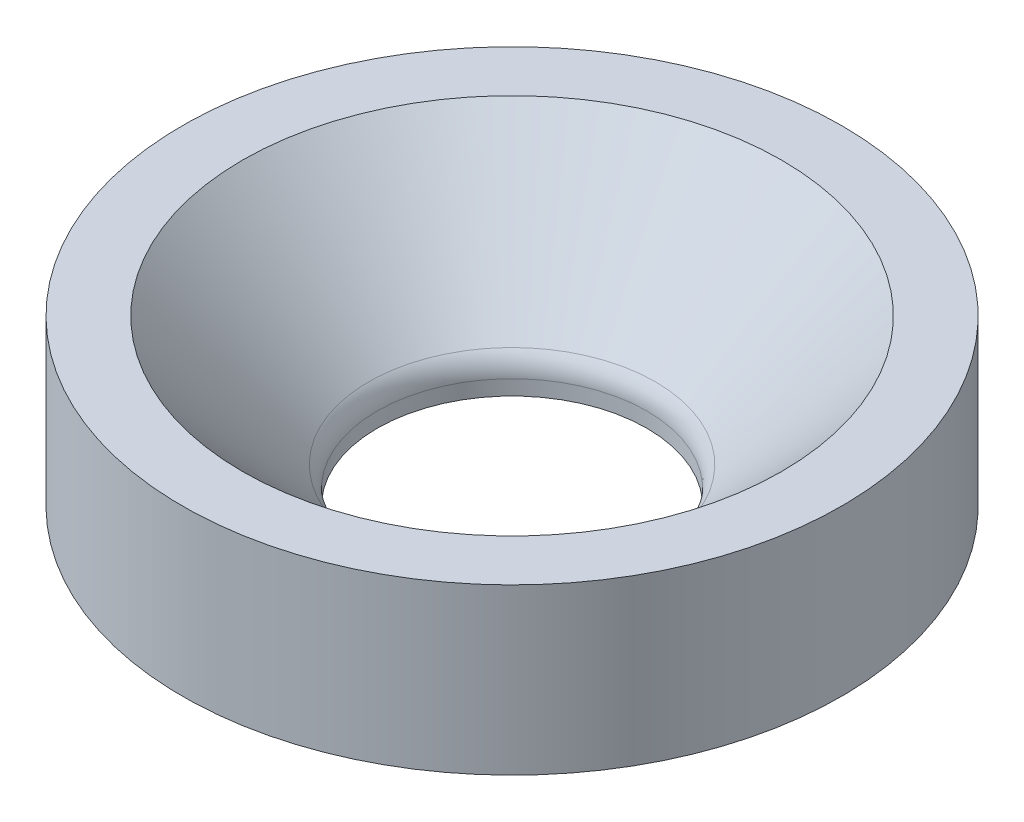
ISO-10303-21;
HEADER;
FILE_DESCRIPTION(('STEP AP214'),'2;1');
FILE_NAME('part.step','',(''),(''),'','','');
FILE_SCHEMA(('AUTOMOTIVE_DESIGN { 1 0 10303 214 1 1 1 1 }'));
ENDSEC;
DATA;
#1=APPLICATION_CONTEXT('core data for automotive mechanical design processes');
#2=APPLICATION_PROTOCOL_DEFINITION('international standard','automotive_design',2000,#1);
#3=PRODUCT_CONTEXT('',#1,'mechanical');
#4=PRODUCT('Part','Part','',(#3));
#5=PRODUCT_RELATED_PRODUCT_CATEGORY('part','',(#4));
#6=PRODUCT_DEFINITION_FORMATION('','',#4);
#7=PRODUCT_DEFINITION_CONTEXT('part definition',#1,'design');
#8=PRODUCT_DEFINITION('design','',#6,#7);
#9=PRODUCT_DEFINITION_SHAPE('','',#8);
#10=(LENGTH_UNIT() NAMED_UNIT(*) SI_UNIT(.MILLI.,.METRE.));
#11=(NAMED_UNIT(*) PLANE_ANGLE_UNIT() SI_UNIT($,.RADIAN.));
#12=(NAMED_UNIT(*) SI_UNIT($,.STERADIAN.) SOLID_ANGLE_UNIT());
#13=UNCERTAINTY_MEASURE_WITH_UNIT(LENGTH_MEASURE(1.E-05),#10,'distance_accuracy_value','');
#14=(GEOMETRIC_REPRESENTATION_CONTEXT(3) GLOBAL_UNCERTAINTY_ASSIGNED_CONTEXT((#13)) GLOBAL_UNIT_ASSIGNED_CONTEXT((#10,
#11,#12)) REPRESENTATION_CONTEXT('',''));
#15=CARTESIAN_POINT('',(0.,0.,0.));
#16=DIRECTION('',(0.,0.,1.));
#17=DIRECTION('',(1.,0.,0.));
#18=AXIS2_PLACEMENT_3D('',#15,#16,#17);
#19=CARTESIAN_POINT('',(0.,0.,0.));
#20=DIRECTION('',(0.,-1.,0.));
#21=DIRECTION('',(0.,0.,-1.));
#22=AXIS2_PLACEMENT_3D('',#19,#20,#21);
#23=CYLINDRICAL_SURFACE('',#22,9.);
#24=CARTESIAN_POINT('',(0.,1.,0.));
#25=DIRECTION('',(0.,-1.,0.));
#26=DIRECTION('',(0.,0.,-1.));
#27=AXIS2_PLACEMENT_3D('',#24,#25,#26);
#28=CIRCLE('',#27,9.);
#29=CARTESIAN_POINT('',(0.,1.,-9.));
#30=VERTEX_POINT('',#29);
#31=EDGE_CURVE('E64',#30,#30,#28,.T.);
#32=ORIENTED_EDGE('',*,*,#31,.F.);
#33=EDGE_LOOP('',(#32));
#34=FACE_BOUND('',#33,.T.);
#35=CARTESIAN_POINT('',(0.,0.,0.));
#36=DIRECTION('',(0.,-1.,0.));
#37=DIRECTION('',(0.,0.,-1.));
#38=AXIS2_PLACEMENT_3D('',#35,#36,#37);
#39=CIRCLE('',#38,9.);
#40=CARTESIAN_POINT('',(0.,0.,-9.));
#41=VERTEX_POINT('',#40);
#42=EDGE_CURVE('E10',#41,#41,#39,.T.);
#43=ORIENTED_EDGE('',*,*,#42,.T.);
#44=EDGE_LOOP('',(#43));
#45=FACE_BOUND('',#44,.T.);
#46=ADVANCED_FACE('F37',(#34,#45),#23,.F.);
#47=CARTESIAN_POINT('',(-9.,0.,0.));
#48=DIRECTION('',(0.,1.,0.));
#49=DIRECTION('',(0.,0.,1.));
#50=AXIS2_PLACEMENT_3D('',#47,#48,#49);
#51=PLANE('',#50);
#52=ORIENTED_EDGE('',*,*,#42,.F.);
#53=EDGE_LOOP('',(#52));
#54=FACE_BOUND('',#53,.T.);
#55=CARTESIAN_POINT('',(0.,0.,0.));
#56=DIRECTION('',(0.,-1.,0.));
#57=DIRECTION('',(0.,0.,-1.));
#58=AXIS2_PLACEMENT_3D('',#55,#56,#57);
#59=CIRCLE('',#58,22.);
#60=CARTESIAN_POINT('',(0.,0.,-22.));
#61=VERTEX_POINT('',#60);
#62=EDGE_CURVE('E44',#61,#61,#59,.T.);
#63=ORIENTED_EDGE('',*,*,#62,.T.);
#64=EDGE_LOOP('',(#63));
#65=FACE_BOUND('',#64,.T.);
#66=ADVANCED_FACE('F72',(#54,#65),#51,.F.);
#67=CARTESIAN_POINT('',(0.,0.,0.));
#68=DIRECTION('',(0.,-1.,0.));
#69=DIRECTION('',(0.,0.,-1.));
#70=AXIS2_PLACEMENT_3D('',#67,#68,#69);
#71=CYLINDRICAL_SURFACE('',#70,22.);
#72=ORIENTED_EDGE('',*,*,#62,.F.);
#73=EDGE_LOOP('',(#72));
#74=FACE_BOUND('',#73,.T.);
#75=CARTESIAN_POINT('',(0.,11.,0.));
#76=DIRECTION('',(0.,-1.,0.));
#77=DIRECTION('',(0.,0.,-1.));
#78=AXIS2_PLACEMENT_3D('',#75,#76,#77);
#79=CIRCLE('',#78,22.);
#80=CARTESIAN_POINT('',(0.,11.,-22.));
#81=VERTEX_POINT('',#80);
#82=EDGE_CURVE('E49',#81,#81,#79,.T.);
#83=ORIENTED_EDGE('',*,*,#82,.T.);
#84=EDGE_LOOP('',(#83));
#85=FACE_BOUND('',#84,.T.);
#86=ADVANCED_FACE('F76',(#74,#85),#71,.T.);
#87=CARTESIAN_POINT('',(-22.,11.,0.));
#88=DIRECTION('',(0.,-1.,0.));
#89=DIRECTION('',(0.,0.,-1.));
#90=AXIS2_PLACEMENT_3D('',#87,#88,#89);
#91=PLANE('',#90);
#92=ORIENTED_EDGE('',*,*,#82,.F.);
#93=EDGE_LOOP('',(#92));
#94=FACE_BOUND('',#93,.T.);
#95=CARTESIAN_POINT('',(0.,11.,0.));
#96=DIRECTION('',(0.,-1.,0.));
#97=DIRECTION('',(0.,0.,-1.));
#98=AXIS2_PLACEMENT_3D('',#95,#96,#97);
#99=CIRCLE('',#98,18.);
#100=CARTESIAN_POINT('',(0.,11.,-18.));
#101=VERTEX_POINT('',#100);
#102=EDGE_CURVE('E54',#101,#101,#99,.T.);
#103=ORIENTED_EDGE('',*,*,#102,.T.);
#104=EDGE_LOOP('',(#103));
#105=FACE_BOUND('',#104,.T.);
#106=ADVANCED_FACE('F81',(#94,#105),#91,.F.);
#107=CARTESIAN_POINT('',(0.,2.39988136981941,0.));
#108=DIRECTION('',(0.,1.,0.));
#109=DIRECTION('',(0.,0.,1.));
#110=AXIS2_PLACEMENT_3D('',#107,#108,#109);
#111=CONICAL_SURFACE('',#110,9.57159804311513,0.775314442251745);
#112=ORIENTED_EDGE('',*,*,#102,.F.);
#113=EDGE_LOOP('',(#112));
#114=FACE_BOUND('',#113,.T.);
#115=CARTESIAN_POINT('',(0.,2.39988136981941,0.));
#116=DIRECTION('',(0.,-1.,0.));
#117=DIRECTION('',(0.,0.,-1.));
#118=AXIS2_PLACEMENT_3D('',#115,#116,#117);
#119=CIRCLE('',#118,9.57159804311513);
#120=CARTESIAN_POINT('',(0.,2.39988136981941,-9.57159804311513));
#121=VERTEX_POINT('',#120);
#122=EDGE_CURVE('E60',#121,#121,#119,.T.);
#123=ORIENTED_EDGE('',*,*,#122,.T.);
#124=EDGE_LOOP('',(#123));
#125=FACE_BOUND('',#124,.T.);
#126=ADVANCED_FACE('F87',(#114,#125),#111,.F.);
#127=CARTESIAN_POINT('',(0.,1.,0.));
#128=DIRECTION('',(0.,-1.,0.));
#129=DIRECTION('',(0.,0.,-1.));
#130=AXIS2_PLACEMENT_3D('',#127,#128,#129);
#131=TOROIDAL_SURFACE('',#130,11.,2.);
#132=ORIENTED_EDGE('',*,*,#122,.F.);
#133=EDGE_LOOP('',(#132));
#134=FACE_BOUND('',#133,.T.);
#135=ORIENTED_EDGE('',*,*,#31,.T.);
#136=EDGE_LOOP('',(#135));
#137=FACE_BOUND('',#136,.T.);
#138=ADVANCED_FACE('F69',(#134,#137),#131,.T.);
#139=CLOSED_SHELL('',(#46,#66,#86,#106,#126,#138));
#140=MANIFOLD_SOLID_BREP('B2',#139);
#141=ADVANCED_BREP_SHAPE_REPRESENTATION('',(#18,#140),#14);
#142=SHAPE_DEFINITION_REPRESENTATION(#9,#141);
ENDSEC;
END-ISO-10303-21;
